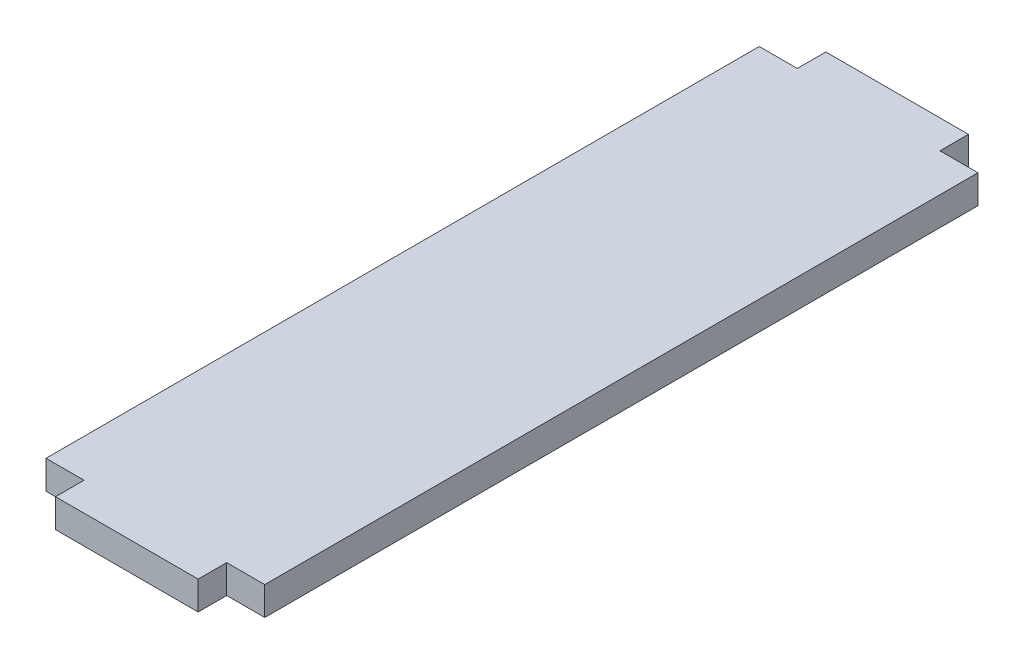
ISO-10303-21;
HEADER;
FILE_DESCRIPTION(('STEP AP214'),'2;1');
FILE_NAME('part.step','',(''),(''),'','','');
FILE_SCHEMA(('AUTOMOTIVE_DESIGN { 1 0 10303 214 1 1 1 1 }'));
ENDSEC;
DATA;
#1=APPLICATION_CONTEXT('core data for automotive mechanical design processes');
#2=APPLICATION_PROTOCOL_DEFINITION('international standard','automotive_design',2000,#1);
#3=PRODUCT_CONTEXT('',#1,'mechanical');
#4=PRODUCT('Part','Part','',(#3));
#5=PRODUCT_RELATED_PRODUCT_CATEGORY('part','',(#4));
#6=PRODUCT_DEFINITION_FORMATION('','',#4);
#7=PRODUCT_DEFINITION_CONTEXT('part definition',#1,'design');
#8=PRODUCT_DEFINITION('design','',#6,#7);
#9=PRODUCT_DEFINITION_SHAPE('','',#8);
#10=(LENGTH_UNIT() NAMED_UNIT(*) SI_UNIT(.MILLI.,.METRE.));
#11=(NAMED_UNIT(*) PLANE_ANGLE_UNIT() SI_UNIT($,.RADIAN.));
#12=(NAMED_UNIT(*) SI_UNIT($,.STERADIAN.) SOLID_ANGLE_UNIT());
#13=UNCERTAINTY_MEASURE_WITH_UNIT(LENGTH_MEASURE(1.E-05),#10,'distance_accuracy_value','');
#14=(GEOMETRIC_REPRESENTATION_CONTEXT(3) GLOBAL_UNCERTAINTY_ASSIGNED_CONTEXT((#13)) GLOBAL_UNIT_ASSIGNED_CONTEXT((#10,
#11,#12)) REPRESENTATION_CONTEXT('',''));
#15=CARTESIAN_POINT('',(0.,0.,0.));
#16=DIRECTION('',(0.,0.,1.));
#17=DIRECTION('',(1.,0.,0.));
#18=AXIS2_PLACEMENT_3D('',#15,#16,#17);
#19=CARTESIAN_POINT('',(5.75,1.5,18.75));
#20=DIRECTION('',(-1.,0.,0.));
#21=DIRECTION('',(0.,0.,1.));
#22=AXIS2_PLACEMENT_3D('',#19,#20,#21);
#23=PLANE('',#22);
#24=DIRECTION('',(0.,0.,-1.));
#25=VECTOR('',#24,1.);
#26=CARTESIAN_POINT('',(5.75,0.,18.75));
#27=LINE('',#26,#25);
#28=CARTESIAN_POINT('',(5.75,0.,18.75));
#29=VERTEX_POINT('',#28);
#30=CARTESIAN_POINT('',(5.75,0.,-18.75));
#31=VERTEX_POINT('',#30);
#32=EDGE_CURVE('E153',#29,#31,#27,.T.);
#33=ORIENTED_EDGE('',*,*,#32,.T.);
#34=DIRECTION('',(0.,-1.,0.));
#35=VECTOR('',#34,1.);
#36=CARTESIAN_POINT('',(5.75,1.5,-18.75));
#37=LINE('',#36,#35);
#38=CARTESIAN_POINT('',(5.75,1.5,-18.75));
#39=VERTEX_POINT('',#38);
#40=EDGE_CURVE('E11',#39,#31,#37,.T.);
#41=ORIENTED_EDGE('',*,*,#40,.F.);
#42=DIRECTION('',(0.,0.,-1.));
#43=VECTOR('',#42,1.);
#44=CARTESIAN_POINT('',(5.75,1.5,18.75));
#45=LINE('',#44,#43);
#46=CARTESIAN_POINT('',(5.75,1.5,18.75));
#47=VERTEX_POINT('',#46);
#48=EDGE_CURVE('E175',#47,#39,#45,.T.);
#49=ORIENTED_EDGE('',*,*,#48,.F.);
#50=DIRECTION('',(0.,-1.,0.));
#51=VECTOR('',#50,1.);
#52=CARTESIAN_POINT('',(5.75,1.5,18.75));
#53=LINE('',#52,#51);
#54=EDGE_CURVE('E149',#47,#29,#53,.T.);
#55=ORIENTED_EDGE('',*,*,#54,.T.);
#56=EDGE_LOOP('',(#33,#41,#49,#55));
#57=FACE_BOUND('',#56,.T.);
#58=ADVANCED_FACE('F33',(#57),#23,.F.);
#59=CARTESIAN_POINT('',(3.75,1.5,-18.75));
#60=DIRECTION('',(0.,0.,1.));
#61=DIRECTION('',(1.,0.,0.));
#62=AXIS2_PLACEMENT_3D('',#59,#60,#61);
#63=PLANE('',#62);
#64=DIRECTION('',(-1.,0.,0.));
#65=VECTOR('',#64,1.);
#66=CARTESIAN_POINT('',(3.75,0.,-18.75));
#67=LINE('',#66,#65);
#68=CARTESIAN_POINT('',(3.75,0.,-18.75));
#69=VERTEX_POINT('',#68);
#70=EDGE_CURVE('E156',#31,#69,#67,.T.);
#71=ORIENTED_EDGE('',*,*,#70,.T.);
#72=DIRECTION('',(0.,-1.,0.));
#73=VECTOR('',#72,1.);
#74=CARTESIAN_POINT('',(3.75,1.5,-18.75));
#75=LINE('',#74,#73);
#76=CARTESIAN_POINT('',(3.75,1.5,-18.75));
#77=VERTEX_POINT('',#76);
#78=EDGE_CURVE('E41',#77,#69,#75,.T.);
#79=ORIENTED_EDGE('',*,*,#78,.F.);
#80=DIRECTION('',(-1.,0.,0.));
#81=VECTOR('',#80,1.);
#82=CARTESIAN_POINT('',(3.75,1.5,-18.75));
#83=LINE('',#82,#81);
#84=EDGE_CURVE('E104',#39,#77,#83,.T.);
#85=ORIENTED_EDGE('',*,*,#84,.F.);
#86=ORIENTED_EDGE('',*,*,#40,.T.);
#87=EDGE_LOOP('',(#71,#79,#85,#86));
#88=FACE_BOUND('',#87,.T.);
#89=ADVANCED_FACE('F253',(#88),#63,.F.);
#90=CARTESIAN_POINT('',(3.75,1.5,-18.75));
#91=DIRECTION('',(-1.,0.,0.));
#92=DIRECTION('',(0.,0.,1.));
#93=AXIS2_PLACEMENT_3D('',#90,#91,#92);
#94=PLANE('',#93);
#95=DIRECTION('',(0.,0.,-1.));
#96=VECTOR('',#95,1.);
#97=CARTESIAN_POINT('',(3.75,0.,-18.75));
#98=LINE('',#97,#96);
#99=CARTESIAN_POINT('',(3.75,0.,-20.25));
#100=VERTEX_POINT('',#99);
#101=EDGE_CURVE('E158',#69,#100,#98,.T.);
#102=ORIENTED_EDGE('',*,*,#101,.T.);
#103=DIRECTION('',(0.,-1.,0.));
#104=VECTOR('',#103,1.);
#105=CARTESIAN_POINT('',(3.75,1.5,-20.25));
#106=LINE('',#105,#104);
#107=CARTESIAN_POINT('',(3.75,1.5,-20.25));
#108=VERTEX_POINT('',#107);
#109=EDGE_CURVE('E194',#108,#100,#106,.T.);
#110=ORIENTED_EDGE('',*,*,#109,.F.);
#111=DIRECTION('',(0.,0.,-1.));
#112=VECTOR('',#111,1.);
#113=CARTESIAN_POINT('',(3.75,1.5,-18.75));
#114=LINE('',#113,#112);
#115=EDGE_CURVE('E202',#77,#108,#114,.T.);
#116=ORIENTED_EDGE('',*,*,#115,.F.);
#117=ORIENTED_EDGE('',*,*,#78,.T.);
#118=EDGE_LOOP('',(#102,#110,#116,#117));
#119=FACE_BOUND('',#118,.T.);
#120=ADVANCED_FACE('F200',(#119),#94,.F.);
#121=CARTESIAN_POINT('',(-3.75,1.5,-20.25));
#122=DIRECTION('',(0.,0.,1.));
#123=DIRECTION('',(1.,0.,0.));
#124=AXIS2_PLACEMENT_3D('',#121,#122,#123);
#125=PLANE('',#124);
#126=DIRECTION('',(-1.,0.,0.));
#127=VECTOR('',#126,1.);
#128=CARTESIAN_POINT('',(-3.75,0.,-20.25));
#129=LINE('',#128,#127);
#130=CARTESIAN_POINT('',(-3.75,0.,-20.25));
#131=VERTEX_POINT('',#130);
#132=EDGE_CURVE('E160',#100,#131,#129,.T.);
#133=ORIENTED_EDGE('',*,*,#132,.T.);
#134=DIRECTION('',(0.,-1.,0.));
#135=VECTOR('',#134,1.);
#136=CARTESIAN_POINT('',(-3.75,1.5,-20.25));
#137=LINE('',#136,#135);
#138=CARTESIAN_POINT('',(-3.75,1.5,-20.25));
#139=VERTEX_POINT('',#138);
#140=EDGE_CURVE('E191',#139,#131,#137,.T.);
#141=ORIENTED_EDGE('',*,*,#140,.F.);
#142=DIRECTION('',(-1.,0.,0.));
#143=VECTOR('',#142,1.);
#144=CARTESIAN_POINT('',(-3.75,1.5,-20.25));
#145=LINE('',#144,#143);
#146=EDGE_CURVE('E220',#108,#139,#145,.T.);
#147=ORIENTED_EDGE('',*,*,#146,.F.);
#148=ORIENTED_EDGE('',*,*,#109,.T.);
#149=EDGE_LOOP('',(#133,#141,#147,#148));
#150=FACE_BOUND('',#149,.T.);
#151=ADVANCED_FACE('F211',(#150),#125,.F.);
#152=CARTESIAN_POINT('',(-3.75,1.5,-18.75));
#153=DIRECTION('',(1.,0.,0.));
#154=DIRECTION('',(0.,0.,-1.));
#155=AXIS2_PLACEMENT_3D('',#152,#153,#154);
#156=PLANE('',#155);
#157=DIRECTION('',(0.,0.,1.));
#158=VECTOR('',#157,1.);
#159=CARTESIAN_POINT('',(-3.75,0.,-18.75));
#160=LINE('',#159,#158);
#161=CARTESIAN_POINT('',(-3.75,0.,-18.75));
#162=VERTEX_POINT('',#161);
#163=EDGE_CURVE('E162',#131,#162,#160,.T.);
#164=ORIENTED_EDGE('',*,*,#163,.T.);
#165=DIRECTION('',(0.,-1.,0.));
#166=VECTOR('',#165,1.);
#167=CARTESIAN_POINT('',(-3.75,1.5,-18.75));
#168=LINE('',#167,#166);
#169=CARTESIAN_POINT('',(-3.75,1.5,-18.75));
#170=VERTEX_POINT('',#169);
#171=EDGE_CURVE('E188',#170,#162,#168,.T.);
#172=ORIENTED_EDGE('',*,*,#171,.F.);
#173=DIRECTION('',(0.,0.,1.));
#174=VECTOR('',#173,1.);
#175=CARTESIAN_POINT('',(-3.75,1.5,-18.75));
#176=LINE('',#175,#174);
#177=EDGE_CURVE('E217',#139,#170,#176,.T.);
#178=ORIENTED_EDGE('',*,*,#177,.F.);
#179=ORIENTED_EDGE('',*,*,#140,.T.);
#180=EDGE_LOOP('',(#164,#172,#178,#179));
#181=FACE_BOUND('',#180,.T.);
#182=ADVANCED_FACE('F215',(#181),#156,.F.);
#183=CARTESIAN_POINT('',(-5.75,1.5,-18.75));
#184=DIRECTION('',(0.,0.,1.));
#185=DIRECTION('',(1.,0.,0.));
#186=AXIS2_PLACEMENT_3D('',#183,#184,#185);
#187=PLANE('',#186);
#188=DIRECTION('',(-1.,0.,0.));
#189=VECTOR('',#188,1.);
#190=CARTESIAN_POINT('',(-5.75,0.,-18.75));
#191=LINE('',#190,#189);
#192=CARTESIAN_POINT('',(-5.75,0.,-18.75));
#193=VERTEX_POINT('',#192);
#194=EDGE_CURVE('E164',#162,#193,#191,.T.);
#195=ORIENTED_EDGE('',*,*,#194,.T.);
#196=DIRECTION('',(0.,-1.,0.));
#197=VECTOR('',#196,1.);
#198=CARTESIAN_POINT('',(-5.75,1.5,-18.75));
#199=LINE('',#198,#197);
#200=CARTESIAN_POINT('',(-5.75,1.5,-18.75));
#201=VERTEX_POINT('',#200);
#202=EDGE_CURVE('E185',#201,#193,#199,.T.);
#203=ORIENTED_EDGE('',*,*,#202,.F.);
#204=DIRECTION('',(-1.,0.,0.));
#205=VECTOR('',#204,1.);
#206=CARTESIAN_POINT('',(-5.75,1.5,-18.75));
#207=LINE('',#206,#205);
#208=EDGE_CURVE('E219',#170,#201,#207,.T.);
#209=ORIENTED_EDGE('',*,*,#208,.F.);
#210=ORIENTED_EDGE('',*,*,#171,.T.);
#211=EDGE_LOOP('',(#195,#203,#209,#210));
#212=FACE_BOUND('',#211,.T.);
#213=ADVANCED_FACE('F266',(#212),#187,.F.);
#214=CARTESIAN_POINT('',(-5.75,1.5,18.75));
#215=DIRECTION('',(1.,0.,0.));
#216=DIRECTION('',(0.,0.,-1.));
#217=AXIS2_PLACEMENT_3D('',#214,#215,#216);
#218=PLANE('',#217);
#219=DIRECTION('',(0.,0.,1.));
#220=VECTOR('',#219,1.);
#221=CARTESIAN_POINT('',(-5.75,0.,18.75));
#222=LINE('',#221,#220);
#223=CARTESIAN_POINT('',(-5.75,0.,18.75));
#224=VERTEX_POINT('',#223);
#225=EDGE_CURVE('E166',#193,#224,#222,.T.);
#226=ORIENTED_EDGE('',*,*,#225,.T.);
#227=DIRECTION('',(0.,-1.,0.));
#228=VECTOR('',#227,1.);
#229=CARTESIAN_POINT('',(-5.75,1.5,18.75));
#230=LINE('',#229,#228);
#231=CARTESIAN_POINT('',(-5.75,1.5,18.75));
#232=VERTEX_POINT('',#231);
#233=EDGE_CURVE('E182',#232,#224,#230,.T.);
#234=ORIENTED_EDGE('',*,*,#233,.F.);
#235=DIRECTION('',(0.,0.,1.));
#236=VECTOR('',#235,1.);
#237=CARTESIAN_POINT('',(-5.75,1.5,18.75));
#238=LINE('',#237,#236);
#239=EDGE_CURVE('E222',#201,#232,#238,.T.);
#240=ORIENTED_EDGE('',*,*,#239,.F.);
#241=ORIENTED_EDGE('',*,*,#202,.T.);
#242=EDGE_LOOP('',(#226,#234,#240,#241));
#243=FACE_BOUND('',#242,.T.);
#244=ADVANCED_FACE('F269',(#243),#218,.F.);
#245=CARTESIAN_POINT('',(-5.75,1.5,18.75));
#246=DIRECTION('',(0.,0.,-1.));
#247=DIRECTION('',(-1.,0.,0.));
#248=AXIS2_PLACEMENT_3D('',#245,#246,#247);
#249=PLANE('',#248);
#250=DIRECTION('',(1.,0.,0.));
#251=VECTOR('',#250,1.);
#252=CARTESIAN_POINT('',(-5.75,0.,18.75));
#253=LINE('',#252,#251);
#254=CARTESIAN_POINT('',(-3.75,0.,18.75));
#255=VERTEX_POINT('',#254);
#256=EDGE_CURVE('E168',#224,#255,#253,.T.);
#257=ORIENTED_EDGE('',*,*,#256,.T.);
#258=DIRECTION('',(0.,-1.,0.));
#259=VECTOR('',#258,1.);
#260=CARTESIAN_POINT('',(-3.75,1.5,18.75));
#261=LINE('',#260,#259);
#262=CARTESIAN_POINT('',(-3.75,1.5,18.75));
#263=VERTEX_POINT('',#262);
#264=EDGE_CURVE('E179',#263,#255,#261,.T.);
#265=ORIENTED_EDGE('',*,*,#264,.F.);
#266=DIRECTION('',(1.,0.,0.));
#267=VECTOR('',#266,1.);
#268=CARTESIAN_POINT('',(-5.75,1.5,18.75));
#269=LINE('',#268,#267);
#270=EDGE_CURVE('E228',#232,#263,#269,.T.);
#271=ORIENTED_EDGE('',*,*,#270,.F.);
#272=ORIENTED_EDGE('',*,*,#233,.T.);
#273=EDGE_LOOP('',(#257,#265,#271,#272));
#274=FACE_BOUND('',#273,.T.);
#275=ADVANCED_FACE('F234',(#274),#249,.F.);
#276=CARTESIAN_POINT('',(-3.75,1.5,18.75));
#277=DIRECTION('',(1.,0.,0.));
#278=DIRECTION('',(0.,0.,-1.));
#279=AXIS2_PLACEMENT_3D('',#276,#277,#278);
#280=PLANE('',#279);
#281=DIRECTION('',(0.,0.,1.));
#282=VECTOR('',#281,1.);
#283=CARTESIAN_POINT('',(-3.75,0.,18.75));
#284=LINE('',#283,#282);
#285=CARTESIAN_POINT('',(-3.75,0.,20.25));
#286=VERTEX_POINT('',#285);
#287=EDGE_CURVE('E170',#255,#286,#284,.T.);
#288=ORIENTED_EDGE('',*,*,#287,.T.);
#289=DIRECTION('',(0.,-1.,0.));
#290=VECTOR('',#289,1.);
#291=CARTESIAN_POINT('',(-3.75,1.5,20.25));
#292=LINE('',#291,#290);
#293=CARTESIAN_POINT('',(-3.75,1.5,20.25));
#294=VERTEX_POINT('',#293);
#295=EDGE_CURVE('E144',#294,#286,#292,.T.);
#296=ORIENTED_EDGE('',*,*,#295,.F.);
#297=DIRECTION('',(0.,0.,1.));
#298=VECTOR('',#297,1.);
#299=CARTESIAN_POINT('',(-3.75,1.5,18.75));
#300=LINE('',#299,#298);
#301=EDGE_CURVE('E135',#263,#294,#300,.T.);
#302=ORIENTED_EDGE('',*,*,#301,.F.);
#303=ORIENTED_EDGE('',*,*,#264,.T.);
#304=EDGE_LOOP('',(#288,#296,#302,#303));
#305=FACE_BOUND('',#304,.T.);
#306=ADVANCED_FACE('F238',(#305),#280,.F.);
#307=CARTESIAN_POINT('',(-3.75,1.5,20.25));
#308=DIRECTION('',(0.,0.,-1.));
#309=DIRECTION('',(-1.,0.,0.));
#310=AXIS2_PLACEMENT_3D('',#307,#308,#309);
#311=PLANE('',#310);
#312=DIRECTION('',(1.,0.,0.));
#313=VECTOR('',#312,1.);
#314=CARTESIAN_POINT('',(-3.75,0.,20.25));
#315=LINE('',#314,#313);
#316=CARTESIAN_POINT('',(3.75,0.,20.25));
#317=VERTEX_POINT('',#316);
#318=EDGE_CURVE('E143',#286,#317,#315,.T.);
#319=ORIENTED_EDGE('',*,*,#318,.T.);
#320=DIRECTION('',(0.,-1.,0.));
#321=VECTOR('',#320,1.);
#322=CARTESIAN_POINT('',(3.75,1.5,20.25));
#323=LINE('',#322,#321);
#324=CARTESIAN_POINT('',(3.75,1.5,20.25));
#325=VERTEX_POINT('',#324);
#326=EDGE_CURVE('E140',#325,#317,#323,.T.);
#327=ORIENTED_EDGE('',*,*,#326,.F.);
#328=DIRECTION('',(1.,0.,0.));
#329=VECTOR('',#328,1.);
#330=CARTESIAN_POINT('',(-3.75,1.5,20.25));
#331=LINE('',#330,#329);
#332=EDGE_CURVE('E129',#294,#325,#331,.T.);
#333=ORIENTED_EDGE('',*,*,#332,.F.);
#334=ORIENTED_EDGE('',*,*,#295,.T.);
#335=EDGE_LOOP('',(#319,#327,#333,#334));
#336=FACE_BOUND('',#335,.T.);
#337=ADVANCED_FACE('F141',(#336),#311,.F.);
#338=CARTESIAN_POINT('',(3.75,1.5,18.75));
#339=DIRECTION('',(-1.,0.,0.));
#340=DIRECTION('',(0.,0.,1.));
#341=AXIS2_PLACEMENT_3D('',#338,#339,#340);
#342=PLANE('',#341);
#343=DIRECTION('',(0.,0.,-1.));
#344=VECTOR('',#343,1.);
#345=CARTESIAN_POINT('',(3.75,0.,18.75));
#346=LINE('',#345,#344);
#347=CARTESIAN_POINT('',(3.75,0.,18.75));
#348=VERTEX_POINT('',#347);
#349=EDGE_CURVE('E90',#317,#348,#346,.T.);
#350=ORIENTED_EDGE('',*,*,#349,.T.);
#351=DIRECTION('',(0.,-1.,0.));
#352=VECTOR('',#351,1.);
#353=CARTESIAN_POINT('',(3.75,1.5,18.75));
#354=LINE('',#353,#352);
#355=CARTESIAN_POINT('',(3.75,1.5,18.75));
#356=VERTEX_POINT('',#355);
#357=EDGE_CURVE('E145',#356,#348,#354,.T.);
#358=ORIENTED_EDGE('',*,*,#357,.F.);
#359=DIRECTION('',(0.,0.,-1.));
#360=VECTOR('',#359,1.);
#361=CARTESIAN_POINT('',(3.75,1.5,18.75));
#362=LINE('',#361,#360);
#363=EDGE_CURVE('E133',#325,#356,#362,.T.);
#364=ORIENTED_EDGE('',*,*,#363,.F.);
#365=ORIENTED_EDGE('',*,*,#326,.T.);
#366=EDGE_LOOP('',(#350,#358,#364,#365));
#367=FACE_BOUND('',#366,.T.);
#368=ADVANCED_FACE('F147',(#367),#342,.F.);
#369=CARTESIAN_POINT('',(3.75,1.5,18.75));
#370=DIRECTION('',(0.,0.,-1.));
#371=DIRECTION('',(-1.,0.,0.));
#372=AXIS2_PLACEMENT_3D('',#369,#370,#371);
#373=PLANE('',#372);
#374=DIRECTION('',(1.,0.,0.));
#375=VECTOR('',#374,1.);
#376=CARTESIAN_POINT('',(3.75,0.,18.75));
#377=LINE('',#376,#375);
#378=EDGE_CURVE('E96',#348,#29,#377,.T.);
#379=ORIENTED_EDGE('',*,*,#378,.T.);
#380=ORIENTED_EDGE('',*,*,#54,.F.);
#381=DIRECTION('',(1.,0.,0.));
#382=VECTOR('',#381,1.);
#383=CARTESIAN_POINT('',(3.75,1.5,18.75));
#384=LINE('',#383,#382);
#385=EDGE_CURVE('E49',#356,#47,#384,.T.);
#386=ORIENTED_EDGE('',*,*,#385,.F.);
#387=ORIENTED_EDGE('',*,*,#357,.T.);
#388=EDGE_LOOP('',(#379,#380,#386,#387));
#389=FACE_BOUND('',#388,.T.);
#390=ADVANCED_FACE('F242',(#389),#373,.F.);
#391=CARTESIAN_POINT('',(0.,1.5,0.));
#392=DIRECTION('',(0.,-1.,0.));
#393=DIRECTION('',(0.,0.,-1.));
#394=AXIS2_PLACEMENT_3D('',#391,#392,#393);
#395=PLANE('',#394);
#396=ORIENTED_EDGE('',*,*,#48,.T.);
#397=ORIENTED_EDGE('',*,*,#84,.T.);
#398=ORIENTED_EDGE('',*,*,#115,.T.);
#399=ORIENTED_EDGE('',*,*,#146,.T.);
#400=ORIENTED_EDGE('',*,*,#177,.T.);
#401=ORIENTED_EDGE('',*,*,#208,.T.);
#402=ORIENTED_EDGE('',*,*,#239,.T.);
#403=ORIENTED_EDGE('',*,*,#270,.T.);
#404=ORIENTED_EDGE('',*,*,#301,.T.);
#405=ORIENTED_EDGE('',*,*,#332,.T.);
#406=ORIENTED_EDGE('',*,*,#363,.T.);
#407=ORIENTED_EDGE('',*,*,#385,.T.);
#408=EDGE_LOOP('',(#396,#397,#398,#399,#400,#401,#402,#403,#404,#405,#406,#407));
#409=FACE_BOUND('',#408,.T.);
#410=ADVANCED_FACE('F131',(#409),#395,.F.);
#411=CARTESIAN_POINT('',(0.,0.,0.));
#412=DIRECTION('',(0.,-1.,0.));
#413=DIRECTION('',(0.,0.,-1.));
#414=AXIS2_PLACEMENT_3D('',#411,#412,#413);
#415=PLANE('',#414);
#416=ORIENTED_EDGE('',*,*,#32,.F.);
#417=ORIENTED_EDGE('',*,*,#378,.F.);
#418=ORIENTED_EDGE('',*,*,#349,.F.);
#419=ORIENTED_EDGE('',*,*,#318,.F.);
#420=ORIENTED_EDGE('',*,*,#287,.F.);
#421=ORIENTED_EDGE('',*,*,#256,.F.);
#422=ORIENTED_EDGE('',*,*,#225,.F.);
#423=ORIENTED_EDGE('',*,*,#194,.F.);
#424=ORIENTED_EDGE('',*,*,#163,.F.);
#425=ORIENTED_EDGE('',*,*,#132,.F.);
#426=ORIENTED_EDGE('',*,*,#101,.F.);
#427=ORIENTED_EDGE('',*,*,#70,.F.);
#428=EDGE_LOOP('',(#416,#417,#418,#419,#420,#421,#422,#423,#424,#425,#426,#427));
#429=FACE_BOUND('',#428,.T.);
#430=ADVANCED_FACE('F206',(#429),#415,.T.);
#431=CLOSED_SHELL('',(#58,#89,#120,#151,#182,#213,#244,#275,#306,#337,#368,#390,#410,#430));
#432=MANIFOLD_SOLID_BREP('B2',#431);
#433=ADVANCED_BREP_SHAPE_REPRESENTATION('',(#18,#432),#14);
#434=SHAPE_DEFINITION_REPRESENTATION(#9,#433);
ENDSEC;
END-ISO-10303-21;
